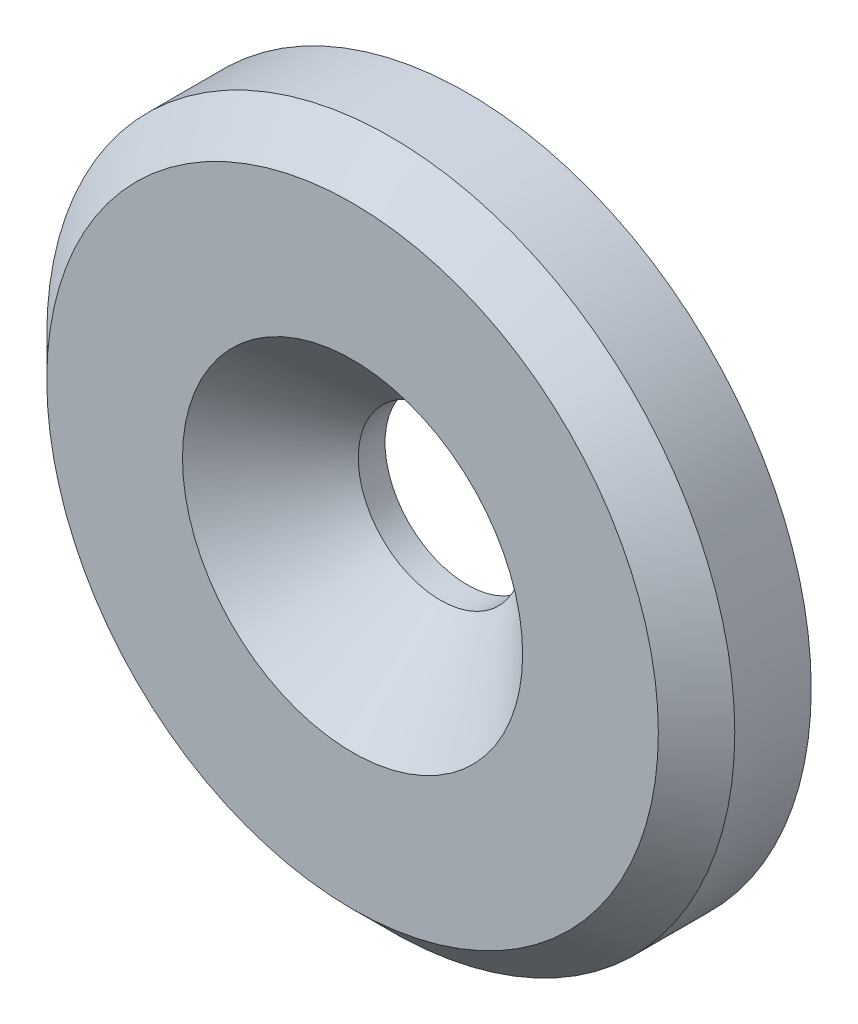
ISO-10303-21;
HEADER;
FILE_DESCRIPTION(('STEP AP214'),'2;1');
FILE_NAME('part.step','',(''),(''),'','','');
FILE_SCHEMA(('AUTOMOTIVE_DESIGN { 1 0 10303 214 1 1 1 1 }'));
ENDSEC;
DATA;
#1=APPLICATION_CONTEXT('core data for automotive mechanical design processes');
#2=APPLICATION_PROTOCOL_DEFINITION('international standard','automotive_design',2000,#1);
#3=PRODUCT_CONTEXT('',#1,'mechanical');
#4=PRODUCT('Part','Part','',(#3));
#5=PRODUCT_RELATED_PRODUCT_CATEGORY('part','',(#4));
#6=PRODUCT_DEFINITION_FORMATION('','',#4);
#7=PRODUCT_DEFINITION_CONTEXT('part definition',#1,'design');
#8=PRODUCT_DEFINITION('design','',#6,#7);
#9=PRODUCT_DEFINITION_SHAPE('','',#8);
#10=(LENGTH_UNIT() NAMED_UNIT(*) SI_UNIT(.MILLI.,.METRE.));
#11=(NAMED_UNIT(*) PLANE_ANGLE_UNIT() SI_UNIT($,.RADIAN.));
#12=(NAMED_UNIT(*) SI_UNIT($,.STERADIAN.) SOLID_ANGLE_UNIT());
#13=UNCERTAINTY_MEASURE_WITH_UNIT(LENGTH_MEASURE(1.E-05),#10,'distance_accuracy_value','');
#14=(GEOMETRIC_REPRESENTATION_CONTEXT(3) GLOBAL_UNCERTAINTY_ASSIGNED_CONTEXT((#13)) GLOBAL_UNIT_ASSIGNED_CONTEXT((#10,
#11,#12)) REPRESENTATION_CONTEXT('',''));
#15=CARTESIAN_POINT('',(0.,0.,0.));
#16=DIRECTION('',(0.,0.,1.));
#17=DIRECTION('',(1.,0.,0.));
#18=AXIS2_PLACEMENT_3D('',#15,#16,#17);
#19=CARTESIAN_POINT('',(0.,0.,3.));
#20=DIRECTION('',(0.,0.,-1.));
#21=DIRECTION('',(-1.,0.,0.));
#22=AXIS2_PLACEMENT_3D('',#19,#20,#21);
#23=CONICAL_SURFACE('',#22,8.,0.785398163397449);
#24=CARTESIAN_POINT('',(0.,0.,2.));
#25=DIRECTION('',(0.,0.,1.));
#26=DIRECTION('',(1.,0.,0.));
#27=AXIS2_PLACEMENT_3D('',#24,#25,#26);
#28=CIRCLE('',#27,9.);
#29=CARTESIAN_POINT('',(9.,0.,2.));
#30=VERTEX_POINT('',#29);
#31=EDGE_CURVE('E57',#30,#30,#28,.T.);
#32=ORIENTED_EDGE('',*,*,#31,.T.);
#33=EDGE_LOOP('',(#32));
#34=FACE_BOUND('',#33,.T.);
#35=CARTESIAN_POINT('',(0.,0.,3.));
#36=DIRECTION('',(0.,0.,1.));
#37=DIRECTION('',(1.,0.,0.));
#38=AXIS2_PLACEMENT_3D('',#35,#36,#37);
#39=CIRCLE('',#38,8.);
#40=CARTESIAN_POINT('',(8.,0.,3.));
#41=VERTEX_POINT('',#40);
#42=EDGE_CURVE('E10',#41,#41,#39,.T.);
#43=ORIENTED_EDGE('',*,*,#42,.F.);
#44=EDGE_LOOP('',(#43));
#45=FACE_BOUND('',#44,.T.);
#46=ADVANCED_FACE('F35',(#34,#45),#23,.T.);
#47=CARTESIAN_POINT('',(4.45,0.,3.));
#48=DIRECTION('',(0.,0.,1.));
#49=DIRECTION('',(1.,0.,0.));
#50=AXIS2_PLACEMENT_3D('',#47,#48,#49);
#51=PLANE('',#50);
#52=ORIENTED_EDGE('',*,*,#42,.T.);
#53=EDGE_LOOP('',(#52));
#54=FACE_BOUND('',#53,.T.);
#55=CARTESIAN_POINT('',(0.,0.,2.99999999999999));
#56=DIRECTION('',(0.,0.,1.));
#57=DIRECTION('',(1.,0.,0.));
#58=AXIS2_PLACEMENT_3D('',#55,#56,#57);
#59=CIRCLE('',#58,4.45);
#60=CARTESIAN_POINT('',(4.45,0.,2.99999999999999));
#61=VERTEX_POINT('',#60);
#62=EDGE_CURVE('E41',#61,#61,#59,.T.);
#63=ORIENTED_EDGE('',*,*,#62,.F.);
#64=EDGE_LOOP('',(#63));
#65=FACE_BOUND('',#64,.T.);
#66=ADVANCED_FACE('F75',(#54,#65),#51,.T.);
#67=CARTESIAN_POINT('',(0.,0.,0.699999999999986));
#68=DIRECTION('',(0.,0.,1.));
#69=DIRECTION('',(1.,0.,0.));
#70=AXIS2_PLACEMENT_3D('',#67,#68,#69);
#71=CONICAL_SURFACE('',#70,2.15,0.785398163397446);
#72=ORIENTED_EDGE('',*,*,#62,.T.);
#73=EDGE_LOOP('',(#72));
#74=FACE_BOUND('',#73,.T.);
#75=CARTESIAN_POINT('',(0.,0.,0.699999999999986));
#76=DIRECTION('',(0.,0.,1.));
#77=DIRECTION('',(1.,0.,0.));
#78=AXIS2_PLACEMENT_3D('',#75,#76,#77);
#79=CIRCLE('',#78,2.15);
#80=CARTESIAN_POINT('',(2.15,0.,0.699999999999986));
#81=VERTEX_POINT('',#80);
#82=EDGE_CURVE('E45',#81,#81,#79,.T.);
#83=ORIENTED_EDGE('',*,*,#82,.F.);
#84=EDGE_LOOP('',(#83));
#85=FACE_BOUND('',#84,.T.);
#86=ADVANCED_FACE('F79',(#74,#85),#71,.F.);
#87=CARTESIAN_POINT('',(0.,0.,-0.00500000000000552));
#88=DIRECTION('',(0.,0.,1.));
#89=DIRECTION('',(1.,0.,0.));
#90=AXIS2_PLACEMENT_3D('',#87,#88,#89);
#91=CYLINDRICAL_SURFACE('',#90,2.15);
#92=ORIENTED_EDGE('',*,*,#82,.T.);
#93=EDGE_LOOP('',(#92));
#94=FACE_BOUND('',#93,.T.);
#95=CARTESIAN_POINT('',(0.,0.,0.));
#96=DIRECTION('',(0.,0.,1.));
#97=DIRECTION('',(1.,0.,0.));
#98=AXIS2_PLACEMENT_3D('',#95,#96,#97);
#99=CIRCLE('',#98,2.15);
#100=CARTESIAN_POINT('',(2.15,0.,0.));
#101=VERTEX_POINT('',#100);
#102=EDGE_CURVE('E49',#101,#101,#99,.T.);
#103=ORIENTED_EDGE('',*,*,#102,.F.);
#104=EDGE_LOOP('',(#103));
#105=FACE_BOUND('',#104,.T.);
#106=ADVANCED_FACE('F71',(#94,#105),#91,.F.);
#107=CARTESIAN_POINT('',(9.,0.,0.));
#108=DIRECTION('',(0.,0.,-1.));
#109=DIRECTION('',(-1.,0.,0.));
#110=AXIS2_PLACEMENT_3D('',#107,#108,#109);
#111=PLANE('',#110);
#112=ORIENTED_EDGE('',*,*,#102,.T.);
#113=EDGE_LOOP('',(#112));
#114=FACE_BOUND('',#113,.T.);
#115=CARTESIAN_POINT('',(0.,0.,0.));
#116=DIRECTION('',(0.,0.,1.));
#117=DIRECTION('',(1.,0.,0.));
#118=AXIS2_PLACEMENT_3D('',#115,#116,#117);
#119=CIRCLE('',#118,9.);
#120=CARTESIAN_POINT('',(9.,0.,0.));
#121=VERTEX_POINT('',#120);
#122=EDGE_CURVE('E54',#121,#121,#119,.T.);
#123=ORIENTED_EDGE('',*,*,#122,.F.);
#124=EDGE_LOOP('',(#123));
#125=FACE_BOUND('',#124,.T.);
#126=ADVANCED_FACE('F65',(#114,#125),#111,.T.);
#127=CARTESIAN_POINT('',(0.,0.,-0.00500000000000552));
#128=DIRECTION('',(0.,0.,1.));
#129=DIRECTION('',(1.,0.,0.));
#130=AXIS2_PLACEMENT_3D('',#127,#128,#129);
#131=CYLINDRICAL_SURFACE('',#130,9.);
#132=ORIENTED_EDGE('',*,*,#122,.T.);
#133=EDGE_LOOP('',(#132));
#134=FACE_BOUND('',#133,.T.);
#135=ORIENTED_EDGE('',*,*,#31,.F.);
#136=EDGE_LOOP('',(#135));
#137=FACE_BOUND('',#136,.T.);
#138=ADVANCED_FACE('F63',(#134,#137),#131,.T.);
#139=CLOSED_SHELL('',(#46,#66,#86,#106,#126,#138));
#140=MANIFOLD_SOLID_BREP('B2',#139);
#141=ADVANCED_BREP_SHAPE_REPRESENTATION('',(#18,#140),#14);
#142=SHAPE_DEFINITION_REPRESENTATION(#9,#141);
ENDSEC;
END-ISO-10303-21;
